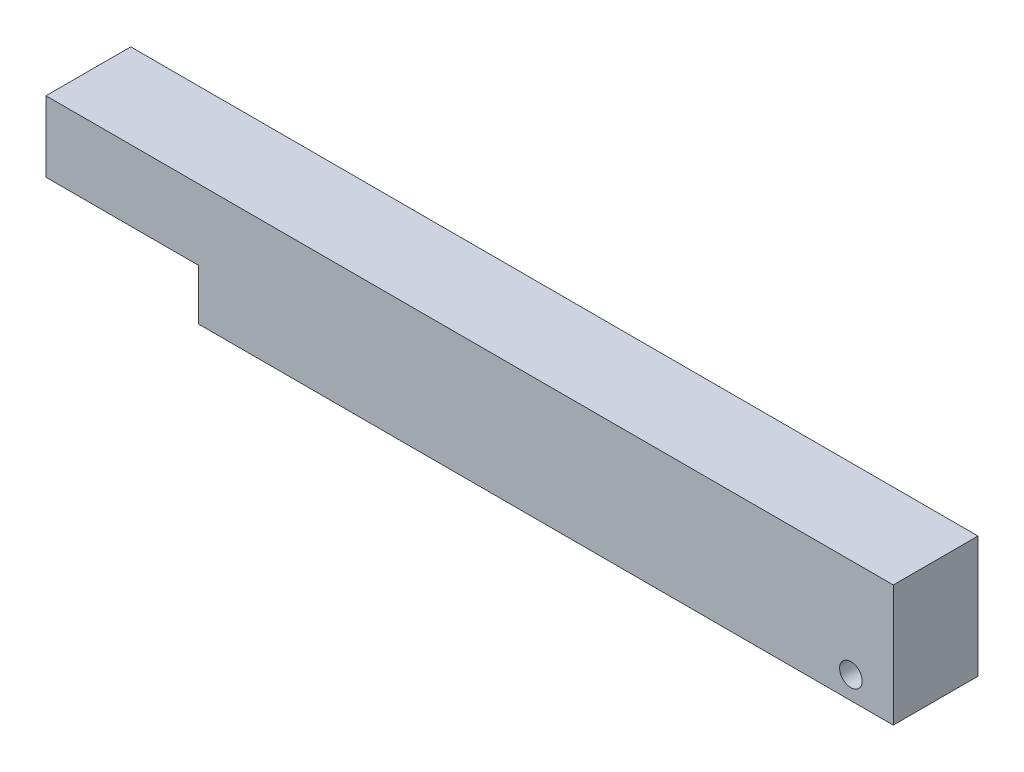
ISO-10303-21;
HEADER;
FILE_DESCRIPTION(('STEP AP214'),'2;1');
FILE_NAME('part.step','',(''),(''),'','','');
FILE_SCHEMA(('AUTOMOTIVE_DESIGN { 1 0 10303 214 1 1 1 1 }'));
ENDSEC;
DATA;
#1=APPLICATION_CONTEXT('core data for automotive mechanical design processes');
#2=APPLICATION_PROTOCOL_DEFINITION('international standard','automotive_design',2000,#1);
#3=PRODUCT_CONTEXT('',#1,'mechanical');
#4=PRODUCT('Part','Part','',(#3));
#5=PRODUCT_RELATED_PRODUCT_CATEGORY('part','',(#4));
#6=PRODUCT_DEFINITION_FORMATION('','',#4);
#7=PRODUCT_DEFINITION_CONTEXT('part definition',#1,'design');
#8=PRODUCT_DEFINITION('design','',#6,#7);
#9=PRODUCT_DEFINITION_SHAPE('','',#8);
#10=(LENGTH_UNIT() NAMED_UNIT(*) SI_UNIT(.MILLI.,.METRE.));
#11=(NAMED_UNIT(*) PLANE_ANGLE_UNIT() SI_UNIT($,.RADIAN.));
#12=(NAMED_UNIT(*) SI_UNIT($,.STERADIAN.) SOLID_ANGLE_UNIT());
#13=UNCERTAINTY_MEASURE_WITH_UNIT(LENGTH_MEASURE(1.E-05),#10,'distance_accuracy_value','');
#14=(GEOMETRIC_REPRESENTATION_CONTEXT(3) GLOBAL_UNCERTAINTY_ASSIGNED_CONTEXT((#13)) GLOBAL_UNIT_ASSIGNED_CONTEXT((#10,
#11,#12)) REPRESENTATION_CONTEXT('',''));
#15=CARTESIAN_POINT('',(0.,0.,0.));
#16=DIRECTION('',(0.,0.,1.));
#17=DIRECTION('',(1.,0.,0.));
#18=AXIS2_PLACEMENT_3D('',#15,#16,#17);
#19=CARTESIAN_POINT('',(0.,0.,30.));
#20=DIRECTION('',(1.,0.,0.));
#21=DIRECTION('',(0.,0.,-1.));
#22=AXIS2_PLACEMENT_3D('',#19,#20,#21);
#23=PLANE('',#22);
#24=DIRECTION('',(0.,-1.,0.));
#25=VECTOR('',#24,1.);
#26=CARTESIAN_POINT('',(0.,0.,0.));
#27=LINE('',#26,#25);
#28=CARTESIAN_POINT('',(0.,25.,0.));
#29=VERTEX_POINT('',#28);
#30=CARTESIAN_POINT('',(0.,0.,0.));
#31=VERTEX_POINT('',#30);
#32=EDGE_CURVE('E123',#29,#31,#27,.T.);
#33=ORIENTED_EDGE('',*,*,#32,.T.);
#34=DIRECTION('',(0.,0.,-1.));
#35=VECTOR('',#34,1.);
#36=CARTESIAN_POINT('',(0.,0.,30.));
#37=LINE('',#36,#35);
#38=CARTESIAN_POINT('',(0.,0.,30.));
#39=VERTEX_POINT('',#38);
#40=EDGE_CURVE('E11',#39,#31,#37,.T.);
#41=ORIENTED_EDGE('',*,*,#40,.F.);
#42=DIRECTION('',(0.,-1.,0.));
#43=VECTOR('',#42,1.);
#44=CARTESIAN_POINT('',(0.,0.,30.));
#45=LINE('',#44,#43);
#46=CARTESIAN_POINT('',(0.,25.,30.));
#47=VERTEX_POINT('',#46);
#48=EDGE_CURVE('E125',#47,#39,#45,.T.);
#49=ORIENTED_EDGE('',*,*,#48,.F.);
#50=DIRECTION('',(0.,0.,-1.));
#51=VECTOR('',#50,1.);
#52=CARTESIAN_POINT('',(0.,25.,30.));
#53=LINE('',#52,#51);
#54=EDGE_CURVE('E131',#47,#29,#53,.T.);
#55=ORIENTED_EDGE('',*,*,#54,.T.);
#56=EDGE_LOOP('',(#33,#41,#49,#55));
#57=FACE_BOUND('',#56,.T.);
#58=ADVANCED_FACE('F33',(#57),#23,.F.);
#59=CARTESIAN_POINT('',(0.,0.,30.));
#60=DIRECTION('',(0.,1.,0.));
#61=DIRECTION('',(0.,0.,1.));
#62=AXIS2_PLACEMENT_3D('',#59,#60,#61);
#63=PLANE('',#62);
#64=DIRECTION('',(1.,0.,0.));
#65=VECTOR('',#64,1.);
#66=CARTESIAN_POINT('',(0.,0.,0.));
#67=LINE('',#66,#65);
#68=CARTESIAN_POINT('',(54.,0.,0.));
#69=VERTEX_POINT('',#68);
#70=EDGE_CURVE('E134',#31,#69,#67,.T.);
#71=ORIENTED_EDGE('',*,*,#70,.T.);
#72=DIRECTION('',(0.,0.,1.));
#73=VECTOR('',#72,1.);
#74=CARTESIAN_POINT('',(54.,0.,0.));
#75=LINE('',#74,#73);
#76=CARTESIAN_POINT('',(54.,0.,30.));
#77=VERTEX_POINT('',#76);
#78=EDGE_CURVE('E114',#69,#77,#75,.T.);
#79=ORIENTED_EDGE('',*,*,#78,.T.);
#80=DIRECTION('',(1.,0.,0.));
#81=VECTOR('',#80,1.);
#82=CARTESIAN_POINT('',(0.,0.,30.));
#83=LINE('',#82,#81);
#84=EDGE_CURVE('E78',#39,#77,#83,.T.);
#85=ORIENTED_EDGE('',*,*,#84,.F.);
#86=ORIENTED_EDGE('',*,*,#40,.T.);
#87=EDGE_LOOP('',(#71,#79,#85,#86));
#88=FACE_BOUND('',#87,.T.);
#89=ADVANCED_FACE('F147',(#88),#63,.F.);
#90=CARTESIAN_POINT('',(300.,0.,30.));
#91=DIRECTION('',(-1.,0.,0.));
#92=DIRECTION('',(0.,0.,1.));
#93=AXIS2_PLACEMENT_3D('',#90,#91,#92);
#94=PLANE('',#93);
#95=DIRECTION('',(0.,1.,0.));
#96=VECTOR('',#95,1.);
#97=CARTESIAN_POINT('',(300.,0.,0.));
#98=LINE('',#97,#96);
#99=CARTESIAN_POINT('',(300.,-18.,0.));
#100=VERTEX_POINT('',#99);
#101=CARTESIAN_POINT('',(300.,25.,0.));
#102=VERTEX_POINT('',#101);
#103=EDGE_CURVE('E110',#100,#102,#98,.T.);
#104=ORIENTED_EDGE('',*,*,#103,.T.);
#105=DIRECTION('',(0.,0.,-1.));
#106=VECTOR('',#105,1.);
#107=CARTESIAN_POINT('',(300.,25.,30.));
#108=LINE('',#107,#106);
#109=CARTESIAN_POINT('',(300.,25.,30.));
#110=VERTEX_POINT('',#109);
#111=EDGE_CURVE('E40',#110,#102,#108,.T.);
#112=ORIENTED_EDGE('',*,*,#111,.F.);
#113=DIRECTION('',(0.,1.,0.));
#114=VECTOR('',#113,1.);
#115=CARTESIAN_POINT('',(300.,0.,30.));
#116=LINE('',#115,#114);
#117=CARTESIAN_POINT('',(300.,-18.,30.));
#118=VERTEX_POINT('',#117);
#119=EDGE_CURVE('E128',#118,#110,#116,.T.);
#120=ORIENTED_EDGE('',*,*,#119,.F.);
#121=DIRECTION('',(0.,0.,1.));
#122=VECTOR('',#121,1.);
#123=CARTESIAN_POINT('',(300.,-18.,0.));
#124=LINE('',#123,#122);
#125=EDGE_CURVE('E102',#100,#118,#124,.T.);
#126=ORIENTED_EDGE('',*,*,#125,.F.);
#127=EDGE_LOOP('',(#104,#112,#120,#126));
#128=FACE_BOUND('',#127,.T.);
#129=ADVANCED_FACE('F145',(#128),#94,.F.);
#130=CARTESIAN_POINT('',(0.,25.,30.));
#131=DIRECTION('',(0.,-1.,0.));
#132=DIRECTION('',(0.,0.,-1.));
#133=AXIS2_PLACEMENT_3D('',#130,#131,#132);
#134=PLANE('',#133);
#135=DIRECTION('',(-1.,0.,0.));
#136=VECTOR('',#135,1.);
#137=CARTESIAN_POINT('',(0.,25.,0.));
#138=LINE('',#137,#136);
#139=EDGE_CURVE('E73',#102,#29,#138,.T.);
#140=ORIENTED_EDGE('',*,*,#139,.T.);
#141=ORIENTED_EDGE('',*,*,#54,.F.);
#142=DIRECTION('',(-1.,0.,0.));
#143=VECTOR('',#142,1.);
#144=CARTESIAN_POINT('',(0.,25.,30.));
#145=LINE('',#144,#143);
#146=EDGE_CURVE('E56',#110,#47,#145,.T.);
#147=ORIENTED_EDGE('',*,*,#146,.F.);
#148=ORIENTED_EDGE('',*,*,#111,.T.);
#149=EDGE_LOOP('',(#140,#141,#147,#148));
#150=FACE_BOUND('',#149,.T.);
#151=ADVANCED_FACE('F139',(#150),#134,.F.);
#152=CARTESIAN_POINT('',(0.,0.,30.));
#153=DIRECTION('',(0.,0.,-1.));
#154=DIRECTION('',(-1.,0.,0.));
#155=AXIS2_PLACEMENT_3D('',#152,#153,#154);
#156=PLANE('',#155);
#157=CARTESIAN_POINT('',(285.,-10.,30.));
#158=DIRECTION('',(0.,0.,-1.));
#159=DIRECTION('',(-1.,0.,0.));
#160=AXIS2_PLACEMENT_3D('',#157,#158,#159);
#161=CIRCLE('',#160,3.99999999999999);
#162=CARTESIAN_POINT('',(281.,-10.,30.));
#163=VERTEX_POINT('',#162);
#164=EDGE_CURVE('E118',#163,#163,#161,.T.);
#165=ORIENTED_EDGE('',*,*,#164,.T.);
#166=EDGE_LOOP('',(#165));
#167=FACE_BOUND('',#166,.T.);
#168=ORIENTED_EDGE('',*,*,#48,.T.);
#169=ORIENTED_EDGE('',*,*,#84,.T.);
#170=DIRECTION('',(0.,-1.,0.));
#171=VECTOR('',#170,1.);
#172=CARTESIAN_POINT('',(54.,0.,30.));
#173=LINE('',#172,#171);
#174=CARTESIAN_POINT('',(54.,-18.,30.));
#175=VERTEX_POINT('',#174);
#176=EDGE_CURVE('E47',#77,#175,#173,.T.);
#177=ORIENTED_EDGE('',*,*,#176,.T.);
#178=DIRECTION('',(1.,0.,0.));
#179=VECTOR('',#178,1.);
#180=CARTESIAN_POINT('',(54.,-18.,30.));
#181=LINE('',#180,#179);
#182=EDGE_CURVE('E100',#175,#118,#181,.T.);
#183=ORIENTED_EDGE('',*,*,#182,.T.);
#184=ORIENTED_EDGE('',*,*,#119,.T.);
#185=ORIENTED_EDGE('',*,*,#146,.T.);
#186=EDGE_LOOP('',(#168,#169,#177,#183,#184,#185));
#187=FACE_BOUND('',#186,.T.);
#188=ADVANCED_FACE('F144',(#167,#187),#156,.F.);
#189=CARTESIAN_POINT('',(0.,0.,0.));
#190=DIRECTION('',(0.,0.,-1.));
#191=DIRECTION('',(-1.,0.,0.));
#192=AXIS2_PLACEMENT_3D('',#189,#190,#191);
#193=PLANE('',#192);
#194=CARTESIAN_POINT('',(285.,-10.,0.));
#195=DIRECTION('',(0.,0.,1.));
#196=DIRECTION('',(1.,0.,0.));
#197=AXIS2_PLACEMENT_3D('',#194,#195,#196);
#198=CIRCLE('',#197,3.99999999999999);
#199=CARTESIAN_POINT('',(289.,-10.,0.));
#200=VERTEX_POINT('',#199);
#201=EDGE_CURVE('E222',#200,#200,#198,.T.);
#202=ORIENTED_EDGE('',*,*,#201,.T.);
#203=EDGE_LOOP('',(#202));
#204=FACE_BOUND('',#203,.T.);
#205=ORIENTED_EDGE('',*,*,#32,.F.);
#206=ORIENTED_EDGE('',*,*,#139,.F.);
#207=ORIENTED_EDGE('',*,*,#103,.F.);
#208=DIRECTION('',(1.,0.,0.));
#209=VECTOR('',#208,1.);
#210=CARTESIAN_POINT('',(54.,-18.,0.));
#211=LINE('',#210,#209);
#212=CARTESIAN_POINT('',(54.,-18.,0.));
#213=VERTEX_POINT('',#212);
#214=EDGE_CURVE('E98',#213,#100,#211,.T.);
#215=ORIENTED_EDGE('',*,*,#214,.F.);
#216=DIRECTION('',(0.,-1.,0.));
#217=VECTOR('',#216,1.);
#218=CARTESIAN_POINT('',(54.,0.,0.));
#219=LINE('',#218,#217);
#220=EDGE_CURVE('E108',#69,#213,#219,.T.);
#221=ORIENTED_EDGE('',*,*,#220,.F.);
#222=ORIENTED_EDGE('',*,*,#70,.F.);
#223=EDGE_LOOP('',(#205,#206,#207,#215,#221,#222));
#224=FACE_BOUND('',#223,.T.);
#225=ADVANCED_FACE('F107',(#204,#224),#193,.T.);
#226=CARTESIAN_POINT('',(54.,0.,0.));
#227=DIRECTION('',(-1.,0.,0.));
#228=DIRECTION('',(0.,0.,1.));
#229=AXIS2_PLACEMENT_3D('',#226,#227,#228);
#230=PLANE('',#229);
#231=ORIENTED_EDGE('',*,*,#176,.F.);
#232=ORIENTED_EDGE('',*,*,#78,.F.);
#233=ORIENTED_EDGE('',*,*,#220,.T.);
#234=DIRECTION('',(0.,0.,1.));
#235=VECTOR('',#234,1.);
#236=CARTESIAN_POINT('',(54.,-18.,0.));
#237=LINE('',#236,#235);
#238=EDGE_CURVE('E94',#213,#175,#237,.T.);
#239=ORIENTED_EDGE('',*,*,#238,.T.);
#240=EDGE_LOOP('',(#231,#232,#233,#239));
#241=FACE_BOUND('',#240,.T.);
#242=ADVANCED_FACE('F113',(#241),#230,.T.);
#243=CARTESIAN_POINT('',(54.,-18.,0.));
#244=DIRECTION('',(0.,-1.,0.));
#245=DIRECTION('',(0.,0.,-1.));
#246=AXIS2_PLACEMENT_3D('',#243,#244,#245);
#247=PLANE('',#246);
#248=ORIENTED_EDGE('',*,*,#182,.F.);
#249=ORIENTED_EDGE('',*,*,#238,.F.);
#250=ORIENTED_EDGE('',*,*,#214,.T.);
#251=ORIENTED_EDGE('',*,*,#125,.T.);
#252=EDGE_LOOP('',(#248,#249,#250,#251));
#253=FACE_BOUND('',#252,.T.);
#254=ADVANCED_FACE('F96',(#253),#247,.T.);
#255=CARTESIAN_POINT('',(285.,-10.,0.));
#256=DIRECTION('',(0.,0.,1.));
#257=DIRECTION('',(1.,0.,0.));
#258=AXIS2_PLACEMENT_3D('',#255,#256,#257);
#259=CYLINDRICAL_SURFACE('',#258,3.99999999999999);
#260=ORIENTED_EDGE('',*,*,#201,.F.);
#261=EDGE_LOOP('',(#260));
#262=FACE_BOUND('',#261,.T.);
#263=ORIENTED_EDGE('',*,*,#164,.F.);
#264=EDGE_LOOP('',(#263));
#265=FACE_BOUND('',#264,.T.);
#266=ADVANCED_FACE('F190',(#262,#265),#259,.F.);
#267=CLOSED_SHELL('',(#58,#89,#129,#151,#188,#225,#242,#254,#266));
#268=MANIFOLD_SOLID_BREP('B2',#267);
#269=ADVANCED_BREP_SHAPE_REPRESENTATION('',(#18,#268),#14);
#270=SHAPE_DEFINITION_REPRESENTATION(#9,#269);
ENDSEC;
END-ISO-10303-21;
